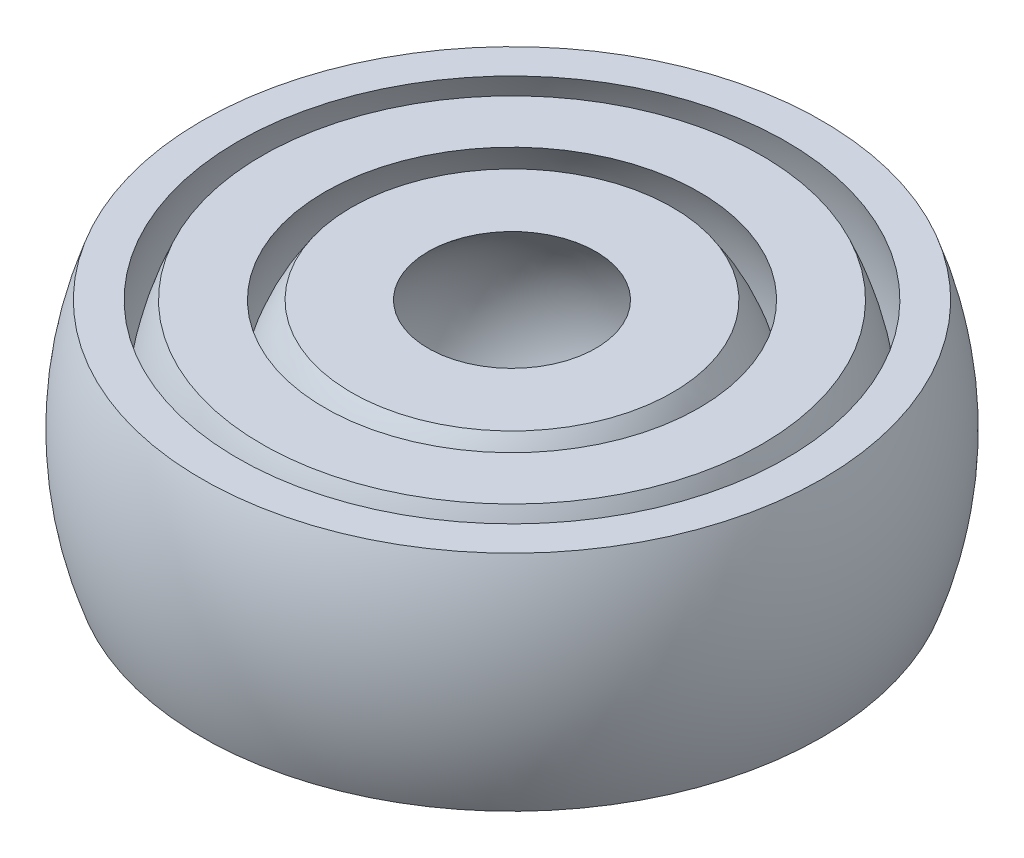
ISO-10303-21;
HEADER;
FILE_DESCRIPTION(('STEP AP214'),'2;1');
FILE_NAME('part.step','',(''),(''),'','','');
FILE_SCHEMA(('AUTOMOTIVE_DESIGN { 1 0 10303 214 1 1 1 1 }'));
ENDSEC;
DATA;
#1=APPLICATION_CONTEXT('core data for automotive mechanical design processes');
#2=APPLICATION_PROTOCOL_DEFINITION('international standard','automotive_design',2000,#1);
#3=PRODUCT_CONTEXT('',#1,'mechanical');
#4=PRODUCT('Part','Part','',(#3));
#5=PRODUCT_RELATED_PRODUCT_CATEGORY('part','',(#4));
#6=PRODUCT_DEFINITION_FORMATION('','',#4);
#7=PRODUCT_DEFINITION_CONTEXT('part definition',#1,'design');
#8=PRODUCT_DEFINITION('design','',#6,#7);
#9=PRODUCT_DEFINITION_SHAPE('','',#8);
#10=(LENGTH_UNIT() NAMED_UNIT(*) SI_UNIT(.MILLI.,.METRE.));
#11=(NAMED_UNIT(*) PLANE_ANGLE_UNIT() SI_UNIT($,.RADIAN.));
#12=(NAMED_UNIT(*) SI_UNIT($,.STERADIAN.) SOLID_ANGLE_UNIT());
#13=UNCERTAINTY_MEASURE_WITH_UNIT(LENGTH_MEASURE(1.E-05),#10,'distance_accuracy_value','');
#14=(GEOMETRIC_REPRESENTATION_CONTEXT(3) GLOBAL_UNCERTAINTY_ASSIGNED_CONTEXT((#13)) GLOBAL_UNIT_ASSIGNED_CONTEXT((#10,
#11,#12)) REPRESENTATION_CONTEXT('',''));
#15=CARTESIAN_POINT('',(0.,0.,0.));
#16=DIRECTION('',(0.,0.,1.));
#17=DIRECTION('',(1.,0.,0.));
#18=AXIS2_PLACEMENT_3D('',#15,#16,#17);
#19=CARTESIAN_POINT('',(0.,0.,0.));
#20=DIRECTION('',(0.,1.,0.));
#21=DIRECTION('',(-1.,0.,0.));
#22=AXIS2_PLACEMENT_3D('',#19,#20,#21);
#23=SPHERICAL_SURFACE('',#22,11.8);
#24=CARTESIAN_POINT('',(0.,-4.,0.));
#25=DIRECTION('',(0.,1.,0.));
#26=DIRECTION('',(0.,0.,1.));
#27=AXIS2_PLACEMENT_3D('',#24,#25,#26);
#28=CIRCLE('',#27,11.1013512691023);
#29=CARTESIAN_POINT('',(-11.1013512691023,-4.,0.));
#30=VERTEX_POINT('',#29);
#31=EDGE_CURVE('E11',#30,#30,#28,.T.);
#32=CARTESIAN_POINT('',(0.,4.,0.));
#33=DIRECTION('',(0.,1.,0.));
#34=DIRECTION('',(0.,0.,1.));
#35=AXIS2_PLACEMENT_3D('',#32,#33,#34);
#36=CIRCLE('',#35,11.1013512691023);
#37=CARTESIAN_POINT('',(-11.1013512691023,4.,0.));
#38=VERTEX_POINT('',#37);
#39=EDGE_CURVE('E65',#38,#38,#36,.T.);
#40=CARTESIAN_POINT('',(-11.1013512691023,-4.,0.));
#41=CARTESIAN_POINT('',(-11.1301710599634,-3.92001579919711,0.));
#42=CARTESIAN_POINT('',(-11.1581261449442,-3.8397200367347,0.));
#43=CARTESIAN_POINT('',(-11.2122944849113,-3.67854311663625,0.));
#44=CARTESIAN_POINT('',(-11.2385077398974,-3.59766195900022,0.));
#45=CARTESIAN_POINT('',(-11.2891800016407,-3.43535197669995,0.));
#46=CARTESIAN_POINT('',(-11.3136390083979,-3.35392315203572,0.));
#47=CARTESIAN_POINT('',(-11.3607913930384,-3.19055589296257,0.));
#48=CARTESIAN_POINT('',(-11.3834847709218,-3.10861745855365,0.));
#49=CARTESIAN_POINT('',(-11.4270952836097,-2.94426925571812,0.));
#50=CARTESIAN_POINT('',(-11.4480124184142,-2.86185948729149,0.));
#51=CARTESIAN_POINT('',(-11.4880606762165,-2.6966071176059,0.));
#52=CARTESIAN_POINT('',(-11.5071917992142,-2.61376451634692,0.));
#53=CARTESIAN_POINT('',(-11.5436590948669,-2.44768518298244,0.));
#54=CARTESIAN_POINT('',(-11.5609952675218,-2.36444845087693,0.));
#55=CARTESIAN_POINT('',(-11.5938645636387,-2.19761974231239,0.));
#56=CARTESIAN_POINT('',(-11.6093976871008,-2.11402776585336,0.));
#57=CARTESIAN_POINT('',(-11.638653628027,-1.9465276209361,0.));
#58=CARTESIAN_POINT('',(-11.652376445491,-1.86261945247788,0.));
#59=CARTESIAN_POINT('',(-11.6780053634325,-1.6945261236618,0.));
#60=CARTESIAN_POINT('',(-11.68991146391,-1.61034096330395,0.));
#61=CARTESIAN_POINT('',(-11.7119013855996,-1.44173298018558,0.));
#62=CARTESIAN_POINT('',(-11.7219852068116,-1.35731015742507,0.));
#63=CARTESIAN_POINT('',(-11.7403258590267,-1.18826629003104,0.));
#64=CARTESIAN_POINT('',(-11.7485826900298,-1.10364524539753,0.));
#65=CARTESIAN_POINT('',(-11.7632655044127,-0.934244467391672,0.));
#66=CARTESIAN_POINT('',(-11.7696914877925,-0.849464734019327,0.));
#67=CARTESIAN_POINT('',(-11.7807096048474,-0.679786185806069,0.));
#68=CARTESIAN_POINT('',(-11.7853017385226,-0.594887370965155,0.));
#69=CARTESIAN_POINT('',(-11.792650010822,-0.425010322717291,0.));
#70=CARTESIAN_POINT('',(-11.7954061494463,-0.340032089310341,0.));
#71=CARTESIAN_POINT('',(-11.7990811440353,-0.170035903935593,0.));
#72=CARTESIAN_POINT('',(-11.8,-0.0850179519677967,0.));
#73=CARTESIAN_POINT('',(-11.8,0.0850179519677967,0.));
#74=CARTESIAN_POINT('',(-11.7990811440353,0.170035903935593,0.));
#75=CARTESIAN_POINT('',(-11.7954061494463,0.340032089310341,0.));
#76=CARTESIAN_POINT('',(-11.792650010822,0.425010322717291,0.));
#77=CARTESIAN_POINT('',(-11.7853017385226,0.594887370965155,0.));
#78=CARTESIAN_POINT('',(-11.7807096048474,0.679786185806069,0.));
#79=CARTESIAN_POINT('',(-11.7696914877925,0.849464734019327,0.));
#80=CARTESIAN_POINT('',(-11.7632655044127,0.934244467391672,0.));
#81=CARTESIAN_POINT('',(-11.7485826900298,1.10364524539753,0.));
#82=CARTESIAN_POINT('',(-11.7403258590267,1.18826629003104,0.));
#83=CARTESIAN_POINT('',(-11.7219852068116,1.35731015742507,0.));
#84=CARTESIAN_POINT('',(-11.7119013855996,1.44173298018558,0.));
#85=CARTESIAN_POINT('',(-11.68991146391,1.61034096330395,0.));
#86=CARTESIAN_POINT('',(-11.6780053634325,1.6945261236618,0.));
#87=CARTESIAN_POINT('',(-11.652376445491,1.86261945247788,0.));
#88=CARTESIAN_POINT('',(-11.638653628027,1.9465276209361,0.));
#89=CARTESIAN_POINT('',(-11.6093976871008,2.11402776585336,0.));
#90=CARTESIAN_POINT('',(-11.5938645636387,2.19761974231239,0.));
#91=CARTESIAN_POINT('',(-11.5609952675218,2.36444845087693,0.));
#92=CARTESIAN_POINT('',(-11.5436590948669,2.44768518298244,0.));
#93=CARTESIAN_POINT('',(-11.5071917992142,2.61376451634692,0.));
#94=CARTESIAN_POINT('',(-11.4880606762165,2.6966071176059,0.));
#95=CARTESIAN_POINT('',(-11.4480124184142,2.86185948729149,0.));
#96=CARTESIAN_POINT('',(-11.4270952836097,2.94426925571811,0.));
#97=CARTESIAN_POINT('',(-11.3834847709218,3.10861745855365,0.));
#98=CARTESIAN_POINT('',(-11.3607913930384,3.19055589296257,0.));
#99=CARTESIAN_POINT('',(-11.3136390083979,3.35392315203572,0.));
#100=CARTESIAN_POINT('',(-11.2891800016407,3.43535197669995,0.));
#101=CARTESIAN_POINT('',(-11.2385077398974,3.59766195900022,0.));
#102=CARTESIAN_POINT('',(-11.2122944849113,3.67854311663625,0.));
#103=CARTESIAN_POINT('',(-11.1581261449442,3.8397200367347,0.));
#104=CARTESIAN_POINT('',(-11.1301710599634,3.92001579919711,0.));
#105=CARTESIAN_POINT('',(-11.1013512691023,4.,0.));
#106=B_SPLINE_CURVE_WITH_KNOTS('',3,(#40,#41,#42,#43,#44,#45,#46,#47,#48,#49,#50,#51,#52,#53,
#54,#55,#56,#57,#58,#59,#60,#61,#62,#63,#64,#65,#66,#67,#68,#69,#70,#71,#72,#73,#74,#75,#76,#77,
#78,#79,#80,#81,#82,#83,#84,#85,#86,#87,#88,#89,#90,#91,#92,#93,#94,#95,#96,#97,#98,#99,#100,
#101,#102,#103,#104,#105),.UNSPECIFIED.,.F.,.F.,(4,2,2,2,2,2,2,2,2,2,2,2,2,2,2,2,2,2,2,2,2,2,2,
2,2,2,2,2,2,2,2,2,4),(0.,0.255048891228276,0.510097782456552,0.765146673684828,1.0201955649131,
1.27524445614138,1.53029334736966,1.78534223859793,2.04039112982621,2.29544002105448,
2.55048891228276,2.80553780351104,3.06058669473931,3.31563558596759,3.57068447719587,
3.82573336842414,4.08078225965242,4.33583115088069,4.59088004210897,4.84592893333725,
5.10097782456552,5.3560267157938,5.61107560702207,5.86612449825035,6.12117338947863,
6.3762222807069,6.63127117193518,6.88632006316345,7.14136895439173,7.39641784562001,
7.65146673684828,7.90651562807656,8.16156451930483),.UNSPECIFIED.);
#107=EDGE_CURVE('BSEAM51',#30,#38,#106,.T.);
#108=ORIENTED_EDGE('',*,*,#31,.T.);
#109=ORIENTED_EDGE('',*,*,#39,.F.);
#110=ORIENTED_EDGE('',*,*,#107,.T.);
#111=ORIENTED_EDGE('',*,*,#107,.F.);
#112=EDGE_LOOP('',(#108,#110,#109,#111));
#113=FACE_BOUND('',#112,.T.);
#114=ADVANCED_FACE('F51',(#113),#23,.T.);
#115=CARTESIAN_POINT('',(-9.81631295344642,-3.99999999999999,0.));
#116=DIRECTION('',(0.,-1.,0.));
#117=DIRECTION('',(0.,0.,-1.));
#118=AXIS2_PLACEMENT_3D('',#115,#116,#117);
#119=PLANE('',#118);
#120=CARTESIAN_POINT('',(0.,-3.99999999999999,0.));
#121=DIRECTION('',(0.,1.,0.));
#122=DIRECTION('',(0.,0.,1.));
#123=AXIS2_PLACEMENT_3D('',#120,#121,#122);
#124=CIRCLE('',#123,9.81631295344643);
#125=CARTESIAN_POINT('',(-9.81631295344643,-3.99999999999999,0.));
#126=VERTEX_POINT('',#125);
#127=EDGE_CURVE('E57',#126,#126,#124,.T.);
#128=ORIENTED_EDGE('',*,*,#127,.T.);
#129=EDGE_LOOP('',(#128));
#130=FACE_BOUND('',#129,.T.);
#131=ORIENTED_EDGE('',*,*,#31,.F.);
#132=EDGE_LOOP('',(#131));
#133=FACE_BOUND('',#132,.T.);
#134=ADVANCED_FACE('F75',(#130,#133),#119,.T.);
#135=CARTESIAN_POINT('',(0.,0.,0.));
#136=DIRECTION('',(0.,1.,0.));
#137=DIRECTION('',(-1.,0.,0.));
#138=AXIS2_PLACEMENT_3D('',#135,#136,#137);
#139=SPHERICAL_SURFACE('',#138,10.6);
#140=CARTESIAN_POINT('',(0.,4.,0.));
#141=DIRECTION('',(0.,1.,0.));
#142=DIRECTION('',(0.,0.,1.));
#143=AXIS2_PLACEMENT_3D('',#140,#141,#142);
#144=CIRCLE('',#143,9.81631295344642);
#145=CARTESIAN_POINT('',(-9.81631295344642,4.,0.));
#146=VERTEX_POINT('',#145);
#147=EDGE_CURVE('E61',#146,#146,#144,.T.);
#148=CARTESIAN_POINT('',(-9.81631295344642,4.,0.));
#149=CARTESIAN_POINT('',(-9.84855834279525,3.92086786663995,0.));
#150=CARTESIAN_POINT('',(-9.87984647175097,3.84134567387143,0.));
#151=CARTESIAN_POINT('',(-9.94049080166358,3.68156801485941,0.));
#152=CARTESIAN_POINT('',(-9.96984700262048,3.60131254861591,0.));
#153=CARTESIAN_POINT('',(-10.0266100693229,3.44011518799585,0.));
#154=CARTESIAN_POINT('',(-10.0540169350684,3.3591732936193,0.));
#155=CARTESIAN_POINT('',(-10.1068653669124,3.19665043842806,0.));
#156=CARTESIAN_POINT('',(-10.1323069330109,3.11506947761337,0.));
#157=CARTESIAN_POINT('',(-10.1812098693757,2.95131619419783,0.));
#158=CARTESIAN_POINT('',(-10.2046712396419,2.86914387159698,0.));
#159=CARTESIAN_POINT('',(-10.2496000679748,2.70425592335841,0.));
#160=CARTESIAN_POINT('',(-10.2710675260414,2.62154029772069,0.));
#161=CARTESIAN_POINT('',(-10.3119959738873,2.45561411768811,0.));
#162=CARTESIAN_POINT('',(-10.3314569636665,2.37240356329325,0.));
#163=CARTESIAN_POINT('',(-10.3683610938573,2.20553619006864,0.));
#164=CARTESIAN_POINT('',(-10.3858042342689,2.12187937123888,0.));
#165=CARTESIAN_POINT('',(-10.4186624643289,1.95416839429772,0.));
#166=CARTESIAN_POINT('',(-10.4340775539773,1.87011423618632,0.));
#167=CARTESIAN_POINT('',(-10.4628706672965,1.7016577382544,0.));
#168=CARTESIAN_POINT('',(-10.4762486909674,1.61725539843388,0.));
#169=CARTESIAN_POINT('',(-10.5009598484284,1.44815189827267,0.));
#170=CARTESIAN_POINT('',(-10.5122929822186,1.36345073793198,0.));
#171=CARTESIAN_POINT('',(-10.5329077319405,1.19379913268222,0.));
#172=CARTESIAN_POINT('',(-10.5421893478722,1.10884868777316,0.));
#173=CARTESIAN_POINT('',(-10.5586956336904,0.938748195127257,0.));
#174=CARTESIAN_POINT('',(-10.5659203035769,0.853598147390413,0.));
#175=CARTESIAN_POINT('',(-10.5783084720865,0.683148247563874,0.));
#176=CARTESIAN_POINT('',(-10.5834719707096,0.59784839547418,0.));
#177=CARTESIAN_POINT('',(-10.591734776913,0.427148773027199,0.));
#178=CARTESIAN_POINT('',(-10.5948340844933,0.341749002669911,0.));
#179=CARTESIAN_POINT('',(-10.5989666960368,0.170899488208416,0.));
#180=CARTESIAN_POINT('',(-10.6,0.0854497441042095,0.));
#181=CARTESIAN_POINT('',(-10.6,-0.0854497441042037,0.));
#182=CARTESIAN_POINT('',(-10.5989666960368,-0.17089948820841,0.));
#183=CARTESIAN_POINT('',(-10.5948340844933,-0.341749002669905,0.));
#184=CARTESIAN_POINT('',(-10.591734776913,-0.427148773027193,0.));
#185=CARTESIAN_POINT('',(-10.5834719707096,-0.597848395474175,0.));
#186=CARTESIAN_POINT('',(-10.5783084720865,-0.683148247563869,0.));
#187=CARTESIAN_POINT('',(-10.5659203035769,-0.853598147390407,0.));
#188=CARTESIAN_POINT('',(-10.5586956336904,-0.938748195127251,0.));
#189=CARTESIAN_POINT('',(-10.5421893478722,-1.10884868777316,0.));
#190=CARTESIAN_POINT('',(-10.5329077319405,-1.19379913268222,0.));
#191=CARTESIAN_POINT('',(-10.5122929822186,-1.36345073793197,0.));
#192=CARTESIAN_POINT('',(-10.5009598484284,-1.44815189827267,0.));
#193=CARTESIAN_POINT('',(-10.4762486909674,-1.61725539843388,0.));
#194=CARTESIAN_POINT('',(-10.4628706672965,-1.70165773825439,0.));
#195=CARTESIAN_POINT('',(-10.4340775539773,-1.87011423618631,0.));
#196=CARTESIAN_POINT('',(-10.4186624643289,-1.95416839429771,0.));
#197=CARTESIAN_POINT('',(-10.3858042342689,-2.12187937123887,0.));
#198=CARTESIAN_POINT('',(-10.3683610938573,-2.20553619006863,0.));
#199=CARTESIAN_POINT('',(-10.3314569636665,-2.37240356329325,0.));
#200=CARTESIAN_POINT('',(-10.3119959738873,-2.45561411768811,0.));
#201=CARTESIAN_POINT('',(-10.2710675260414,-2.62154029772068,0.));
#202=CARTESIAN_POINT('',(-10.2496000679748,-2.7042559233584,0.));
#203=CARTESIAN_POINT('',(-10.2046712396419,-2.86914387159697,0.));
#204=CARTESIAN_POINT('',(-10.1812098693757,-2.95131619419782,0.));
#205=CARTESIAN_POINT('',(-10.1323069330109,-3.11506947761337,0.));
#206=CARTESIAN_POINT('',(-10.1068653669124,-3.19665043842805,0.));
#207=CARTESIAN_POINT('',(-10.0540169350684,-3.35917329361929,0.));
#208=CARTESIAN_POINT('',(-10.0266100693229,-3.44011518799585,0.));
#209=CARTESIAN_POINT('',(-9.96984700262049,-3.6013125486159,0.));
#210=CARTESIAN_POINT('',(-9.94049080166358,-3.68156801485941,0.));
#211=CARTESIAN_POINT('',(-9.87984647175097,-3.84134567387142,0.));
#212=CARTESIAN_POINT('',(-9.84855834279526,-3.92086786663994,0.));
#213=CARTESIAN_POINT('',(-9.81631295344643,-3.99999999999999,0.));
#214=B_SPLINE_CURVE_WITH_KNOTS('',3,(#148,#149,#150,#151,#152,#153,#154,#155,#156,#157,#158,
#159,#160,#161,#162,#163,#164,#165,#166,#167,#168,#169,#170,#171,#172,#173,#174,#175,#176,#177,
#178,#179,#180,#181,#182,#183,#184,#185,#186,#187,#188,#189,#190,#191,#192,#193,#194,#195,#196,
#197,#198,#199,#200,#201,#202,#203,#204,#205,#206,#207,#208,#209,#210,#211,#212,#213),
.UNSPECIFIED.,.F.,.F.,(4,2,2,2,2,2,2,2,2,2,2,2,2,2,2,2,2,2,2,2,2,2,2,2,2,2,2,2,2,2,2,2,4),(0.,
0.256342985822636,0.512685971645271,0.769028957467907,1.02537194329054,1.28171492911318,
1.53805791493581,1.79440090075845,2.05074388658108,2.30708687240372,2.56342985822635,
2.81977284404899,3.07611582987162,3.33245881569426,3.58880180151689,3.84514478733953,
4.10148777316216,4.3578307589848,4.61417374480743,4.87051673063007,5.1268597164527,
5.38320270227534,5.63954568809797,5.89588867392061,6.15223165974324,6.40857464556588,
6.66491763138851,6.92126061721115,7.17760360303378,7.43394658885642,7.69028957467905,
7.94663256050169,8.20297554632432),.UNSPECIFIED.);
#215=EDGE_CURVE('BSEAM79',#146,#126,#214,.T.);
#216=ORIENTED_EDGE('',*,*,#147,.T.);
#217=ORIENTED_EDGE('',*,*,#127,.F.);
#218=ORIENTED_EDGE('',*,*,#215,.T.);
#219=ORIENTED_EDGE('',*,*,#215,.F.);
#220=EDGE_LOOP('',(#216,#218,#217,#219));
#221=FACE_BOUND('',#220,.T.);
#222=ADVANCED_FACE('F79',(#221),#139,.F.);
#223=CARTESIAN_POINT('',(-9.81631295344642,4.,0.));
#224=DIRECTION('',(0.,1.,0.));
#225=DIRECTION('',(0.,0.,1.));
#226=AXIS2_PLACEMENT_3D('',#223,#224,#225);
#227=PLANE('',#226);
#228=ORIENTED_EDGE('',*,*,#39,.T.);
#229=EDGE_LOOP('',(#228));
#230=FACE_BOUND('',#229,.T.);
#231=ORIENTED_EDGE('',*,*,#147,.F.);
#232=EDGE_LOOP('',(#231));
#233=FACE_BOUND('',#232,.T.);
#234=ADVANCED_FACE('F71',(#230,#233),#227,.T.);
#235=CLOSED_SHELL('',(#114,#134,#222,#234));
#236=MANIFOLD_SOLID_BREP('B2',#235);
#237=CARTESIAN_POINT('',(0.,0.,0.));
#238=DIRECTION('',(0.,1.,0.));
#239=DIRECTION('',(1.,0.,0.));
#240=AXIS2_PLACEMENT_3D('',#237,#238,#239);
#241=SPHERICAL_SURFACE('',#240,7.8);
#242=CARTESIAN_POINT('',(0.,4.,0.));
#243=DIRECTION('',(0.,1.,0.));
#244=DIRECTION('',(0.,0.,1.));
#245=AXIS2_PLACEMENT_3D('',#242,#243,#244);
#246=CIRCLE('',#245,6.69626761711328);
#247=CARTESIAN_POINT('',(6.69626761711328,4.,0.));
#248=VERTEX_POINT('',#247);
#249=EDGE_CURVE('E144',#248,#248,#246,.T.);
#250=CARTESIAN_POINT('',(0.,-4.,0.));
#251=DIRECTION('',(0.,1.,0.));
#252=DIRECTION('',(0.,0.,1.));
#253=AXIS2_PLACEMENT_3D('',#250,#251,#252);
#254=CIRCLE('',#253,6.69626761711328);
#255=CARTESIAN_POINT('',(6.69626761711328,-4.,0.));
#256=VERTEX_POINT('',#255);
#257=EDGE_CURVE('E50',#256,#256,#254,.T.);
#258=CARTESIAN_POINT('',(6.69626761711328,4.,0.));
#259=CARTESIAN_POINT('',(6.74114039020911,3.92488114280004,0.));
#260=CARTESIAN_POINT('',(6.78474809918697,3.84900664312521,0.));
#261=CARTESIAN_POINT('',(6.86938630518451,3.69583355845356,0.));
#262=CARTESIAN_POINT('',(6.9104168022042,3.61853497345673,0.));
#263=CARTESIAN_POINT('',(6.98985350056321,3.46260091776879,0.));
#264=CARTESIAN_POINT('',(7.02825970190254,3.38396544707768,0.));
#265=CARTESIAN_POINT('',(7.10240447924619,3.22544676578967,0.));
#266=CARTESIAN_POINT('',(7.13814305525052,3.14556355519277,0.));
#267=CARTESIAN_POINT('',(7.20691206379606,2.98463983715201,0.));
#268=CARTESIAN_POINT('',(7.23994249633729,2.90359932970814,0.));
#269=CARTESIAN_POINT('',(7.30325782294333,2.74045280269426,0.));
#270=CARTESIAN_POINT('',(7.33354271700815,2.65834678312425,0.));
#271=CARTESIAN_POINT('',(7.39133266591808,2.49316221495515,0.));
#272=CARTESIAN_POINT('',(7.4188377207632,2.41008366635607,0.));
#273=CARTESIAN_POINT('',(7.4710368426825,2.24304812684007,0.));
#274=CARTESIAN_POINT('',(7.49573090975667,2.15909113592316,0.));
#275=CARTESIAN_POINT('',(7.54228008993898,1.99039379271953,0.));
#276=CARTESIAN_POINT('',(7.56413520304711,1.90565344043281,0.));
#277=CARTESIAN_POINT('',(7.60498172449966,1.73548534275223,0.));
#278=CARTESIAN_POINT('',(7.62397313284408,1.65005759735836,0.));
#279=CARTESIAN_POINT('',(7.65907073703221,1.47861146015422,0.));
#280=CARTESIAN_POINT('',(7.67517693287591,1.39259306834393,0.));
#281=CARTESIAN_POINT('',(7.70448587184203,1.22006305391468,0.));
#282=CARTESIAN_POINT('',(7.71768861496444,1.1335514312957,0.));
#283=CARTESIAN_POINT('',(7.74117569641451,0.960132929436343,0.));
#284=CARTESIAN_POINT('',(7.75146003474217,0.873226050195953,0.));
#285=CARTESIAN_POINT('',(7.76909865961659,0.699115456908946,0.));
#286=CARTESIAN_POINT('',(7.77645294616335,0.611911742862328,0.));
#287=CARTESIAN_POINT('',(7.78822313876549,0.437306237942481,0.));
#288=CARTESIAN_POINT('',(7.79263904482087,0.349904447069251,0.));
#289=CARTESIAN_POINT('',(7.79852747543812,0.175001770797347,0.));
#290=CARTESIAN_POINT('',(7.8,0.0875008853986726,0.));
#291=CARTESIAN_POINT('',(7.8,-0.0875008853986761,0.));
#292=CARTESIAN_POINT('',(7.79852747543812,-0.17500177079735,0.));
#293=CARTESIAN_POINT('',(7.79263904482087,-0.349904447069254,0.));
#294=CARTESIAN_POINT('',(7.78822313876549,-0.437306237942484,0.));
#295=CARTESIAN_POINT('',(7.77645294616335,-0.611911742862331,0.));
#296=CARTESIAN_POINT('',(7.76909865961658,-0.699115456908949,0.));
#297=CARTESIAN_POINT('',(7.75146003474217,-0.873226050195957,0.));
#298=CARTESIAN_POINT('',(7.74117569641451,-0.960132929436346,0.));
#299=CARTESIAN_POINT('',(7.71768861496444,-1.13355143129571,0.));
#300=CARTESIAN_POINT('',(7.70448587184203,-1.22006305391468,0.));
#301=CARTESIAN_POINT('',(7.67517693287591,-1.39259306834393,0.));
#302=CARTESIAN_POINT('',(7.65907073703221,-1.47861146015422,0.));
#303=CARTESIAN_POINT('',(7.62397313284408,-1.65005759735837,0.));
#304=CARTESIAN_POINT('',(7.60498172449966,-1.73548534275223,0.));
#305=CARTESIAN_POINT('',(7.5641352030471,-1.90565344043281,0.));
#306=CARTESIAN_POINT('',(7.54228008993897,-1.99039379271953,0.));
#307=CARTESIAN_POINT('',(7.49573090975667,-2.15909113592316,0.));
#308=CARTESIAN_POINT('',(7.4710368426825,-2.24304812684007,0.));
#309=CARTESIAN_POINT('',(7.4188377207632,-2.41008366635607,0.));
#310=CARTESIAN_POINT('',(7.39133266591808,-2.49316221495516,0.));
#311=CARTESIAN_POINT('',(7.33354271700815,-2.65834678312425,0.));
#312=CARTESIAN_POINT('',(7.30325782294333,-2.74045280269426,0.));
#313=CARTESIAN_POINT('',(7.23994249633729,-2.90359932970814,0.));
#314=CARTESIAN_POINT('',(7.20691206379606,-2.98463983715201,0.));
#315=CARTESIAN_POINT('',(7.13814305525052,-3.14556355519278,0.));
#316=CARTESIAN_POINT('',(7.10240447924619,-3.22544676578967,0.));
#317=CARTESIAN_POINT('',(7.02825970190254,-3.38396544707769,0.));
#318=CARTESIAN_POINT('',(6.98985350056321,-3.4626009177688,0.));
#319=CARTESIAN_POINT('',(6.9104168022042,-3.61853497345674,0.));
#320=CARTESIAN_POINT('',(6.86938630518451,-3.69583355845357,0.));
#321=CARTESIAN_POINT('',(6.78474809918696,-3.84900664312522,0.));
#322=CARTESIAN_POINT('',(6.74114039020911,-3.92488114280004,0.));
#323=CARTESIAN_POINT('',(6.69626761711328,-4.,0.));
#324=B_SPLINE_CURVE_WITH_KNOTS('',3,(#258,#259,#260,#261,#262,#263,#264,#265,#266,#267,#268,
#269,#270,#271,#272,#273,#274,#275,#276,#277,#278,#279,#280,#281,#282,#283,#284,#285,#286,#287,
#288,#289,#290,#291,#292,#293,#294,#295,#296,#297,#298,#299,#300,#301,#302,#303,#304,#305,#306,
#307,#308,#309,#310,#311,#312,#313,#314,#315,#316,#317,#318,#319,#320,#321,#322,#323),
.UNSPECIFIED.,.F.,.F.,(4,2,2,2,2,2,2,2,2,2,2,2,2,2,2,2,2,2,2,2,2,2,2,2,2,2,2,2,2,2,2,2,4),(0.,
0.262490270257468,0.524980540514937,0.787470810772405,1.04996108102987,1.31245135128734,
1.57494162154481,1.83743189180228,2.09992216205975,2.36241243231721,2.62490270257468,
2.88739297283215,3.14988324308962,3.41237351334709,3.67486378360456,3.93735405386203,
4.19984432411949,4.46233459437696,4.72482486463443,4.9873151348919,5.24980540514937,
5.51229567540684,5.7747859456643,6.03727621592177,6.29976648617924,6.56225675643671,
6.82474702669418,7.08723729695165,7.34972756720911,7.61221783746658,7.87470810772405,
8.13719837798152,8.39968864823899),.UNSPECIFIED.);
#325=EDGE_CURVE('BSEAM127',#248,#256,#324,.T.);
#326=ORIENTED_EDGE('',*,*,#249,.T.);
#327=ORIENTED_EDGE('',*,*,#257,.F.);
#328=ORIENTED_EDGE('',*,*,#325,.T.);
#329=ORIENTED_EDGE('',*,*,#325,.F.);
#330=EDGE_LOOP('',(#326,#328,#327,#329));
#331=FACE_BOUND('',#330,.T.);
#332=ADVANCED_FACE('F127',(#331),#241,.F.);
#333=CARTESIAN_POINT('',(0.,-4.,0.));
#334=DIRECTION('',(0.,1.,0.));
#335=DIRECTION('',(0.,0.,1.));
#336=AXIS2_PLACEMENT_3D('',#333,#334,#335);
#337=PLANE('',#336);
#338=CARTESIAN_POINT('',(0.,-4.,0.));
#339=DIRECTION('',(0.,1.,0.));
#340=DIRECTION('',(0.,0.,1.));
#341=AXIS2_PLACEMENT_3D('',#338,#339,#340);
#342=CIRCLE('',#341,8.94650769853802);
#343=CARTESIAN_POINT('',(8.94650769853802,-4.,0.));
#344=VERTEX_POINT('',#343);
#345=EDGE_CURVE('E134',#344,#344,#342,.T.);
#346=ORIENTED_EDGE('',*,*,#345,.F.);
#347=EDGE_LOOP('',(#346));
#348=FACE_BOUND('',#347,.T.);
#349=ORIENTED_EDGE('',*,*,#257,.T.);
#350=EDGE_LOOP('',(#349));
#351=FACE_BOUND('',#350,.T.);
#352=ADVANCED_FACE('F161',(#348,#351),#337,.F.);
#353=CARTESIAN_POINT('',(0.,0.,0.));
#354=DIRECTION('',(0.,1.,0.));
#355=DIRECTION('',(1.,0.,0.));
#356=AXIS2_PLACEMENT_3D('',#353,#354,#355);
#357=SPHERICAL_SURFACE('',#356,9.8);
#358=CARTESIAN_POINT('',(0.,4.,0.));
#359=DIRECTION('',(0.,1.,0.));
#360=DIRECTION('',(0.,0.,1.));
#361=AXIS2_PLACEMENT_3D('',#358,#359,#360);
#362=CIRCLE('',#361,8.94650769853802);
#363=CARTESIAN_POINT('',(8.94650769853802,4.,0.));
#364=VERTEX_POINT('',#363);
#365=EDGE_CURVE('E139',#364,#364,#362,.T.);
#366=CARTESIAN_POINT('',(8.94650769853802,4.,0.));
#367=CARTESIAN_POINT('',(8.98154472307547,3.92163593252445,0.));
#368=CARTESIAN_POINT('',(9.01555163086516,3.84281131190357,0.));
#369=CARTESIAN_POINT('',(9.08148286624306,3.68429586220221,0.));
#370=CARTESIAN_POINT('',(9.11340719383127,3.60460503312172,0.));
#371=CARTESIAN_POINT('',(9.1751509221002,3.44441206433217,0.));
#372=CARTESIAN_POINT('',(9.20497032278093,3.3639099246231,0.));
#373=CARTESIAN_POINT('',(9.26248368922102,3.20214995285234,0.));
#374=CARTESIAN_POINT('',(9.29017765498038,3.12089212079064,0.));
#375=CARTESIAN_POINT('',(9.34342100787445,2.95767686143327,0.));
#376=CARTESIAN_POINT('',(9.36897039500915,2.8757194341376,0.));
#377=CARTESIAN_POINT('',(9.41790695538373,2.71116157598736,0.));
#378=CARTESIAN_POINT('',(9.44129412862362,2.62856114513278,0.));
#379=CARTESIAN_POINT('',(9.48589011147247,2.46277431243219,0.));
#380=CARTESIAN_POINT('',(9.50709892108144,2.37958791058618,0.));
#381=CARTESIAN_POINT('',(9.54732353301586,2.21268657389239,0.));
#382=CARTESIAN_POINT('',(9.56633933534131,2.1289716390446,0.));
#383=CARTESIAN_POINT('',(9.6021648027323,1.96107103905239,0.));
#384=CARTESIAN_POINT('',(9.61897446779784,1.87688537390797,0.));
#385=CARTESIAN_POINT('',(9.65037605410944,1.70810144111264,0.));
#386=CARTESIAN_POINT('',(9.66496797535551,1.62350317346173,0.));
#387=CARTESIAN_POINT('',(9.69192399871867,1.45395244831784,0.));
#388=CARTESIAN_POINT('',(9.70428810083575,1.36899999082486,0.));
#389=CARTESIAN_POINT('',(9.72677994888662,1.19879954322338,0.));
#390=CARTESIAN_POINT('',(9.7369076948204,1.11355155311489,0.));
#391=CARTESIAN_POINT('',(9.75491983758715,0.942818901564571,0.));
#392=CARTESIAN_POINT('',(9.76280423442012,0.857334240122745,0.));
#393=CARTESIAN_POINT('',(9.77632423503642,0.686187270602985,0.));
#394=CARTESIAN_POINT('',(9.78195983881974,0.600524962525052,0.));
#395=CARTESIAN_POINT('',(9.79097836211458,0.429081847090108,0.));
#396=CARTESIAN_POINT('',(9.79436128162609,0.343301039733097,0.));
#397=CARTESIAN_POINT('',(9.7988721005688,0.17168015491739,0.));
#398=CARTESIAN_POINT('',(9.8,0.0858400774586942,0.));
#399=CARTESIAN_POINT('',(9.8,-0.0858400774586975,0.));
#400=CARTESIAN_POINT('',(9.7988721005688,-0.171680154917393,0.));
#401=CARTESIAN_POINT('',(9.79436128162609,-0.3433010397331,0.));
#402=CARTESIAN_POINT('',(9.79097836211458,-0.429081847090111,0.));
#403=CARTESIAN_POINT('',(9.78195983881974,-0.600524962525055,0.));
#404=CARTESIAN_POINT('',(9.77632423503642,-0.686187270602989,0.));
#405=CARTESIAN_POINT('',(9.76280423442012,-0.857334240122748,0.));
#406=CARTESIAN_POINT('',(9.75491983758715,-0.942818901564573,0.));
#407=CARTESIAN_POINT('',(9.7369076948204,-1.11355155311489,0.));
#408=CARTESIAN_POINT('',(9.72677994888662,-1.19879954322339,0.));
#409=CARTESIAN_POINT('',(9.70428810083575,-1.36899999082486,0.));
#410=CARTESIAN_POINT('',(9.69192399871867,-1.45395244831784,0.));
#411=CARTESIAN_POINT('',(9.66496797535551,-1.62350317346173,0.));
#412=CARTESIAN_POINT('',(9.65037605410944,-1.70810144111264,0.));
#413=CARTESIAN_POINT('',(9.61897446779784,-1.87688537390797,0.));
#414=CARTESIAN_POINT('',(9.6021648027323,-1.9610710390524,0.));
#415=CARTESIAN_POINT('',(9.56633933534131,-2.12897163904461,0.));
#416=CARTESIAN_POINT('',(9.54732353301586,-2.21268657389239,0.));
#417=CARTESIAN_POINT('',(9.50709892108143,-2.37958791058618,0.));
#418=CARTESIAN_POINT('',(9.48589011147247,-2.4627743124322,0.));
#419=CARTESIAN_POINT('',(9.44129412862362,-2.62856114513278,0.));
#420=CARTESIAN_POINT('',(9.41790695538373,-2.71116157598736,0.));
#421=CARTESIAN_POINT('',(9.36897039500915,-2.8757194341376,0.));
#422=CARTESIAN_POINT('',(9.34342100787445,-2.95767686143327,0.));
#423=CARTESIAN_POINT('',(9.29017765498038,-3.12089212079064,0.));
#424=CARTESIAN_POINT('',(9.26248368922102,-3.20214995285234,0.));
#425=CARTESIAN_POINT('',(9.20497032278093,-3.36390992462311,0.));
#426=CARTESIAN_POINT('',(9.1751509221002,-3.44441206433217,0.));
#427=CARTESIAN_POINT('',(9.11340719383127,-3.60460503312172,0.));
#428=CARTESIAN_POINT('',(9.08148286624306,-3.68429586220221,0.));
#429=CARTESIAN_POINT('',(9.01555163086516,-3.84281131190358,0.));
#430=CARTESIAN_POINT('',(8.98154472307547,-3.92163593252445,0.));
#431=CARTESIAN_POINT('',(8.94650769853802,-4.,0.));
#432=B_SPLINE_CURVE_WITH_KNOTS('',3,(#366,#367,#368,#369,#370,#371,#372,#373,#374,#375,#376,
#377,#378,#379,#380,#381,#382,#383,#384,#385,#386,#387,#388,#389,#390,#391,#392,#393,#394,#395,
#396,#397,#398,#399,#400,#401,#402,#403,#404,#405,#406,#407,#408,#409,#410,#411,#412,#413,#414,
#415,#416,#417,#418,#419,#420,#421,#422,#423,#424,#425,#426,#427,#428,#429,#430,#431),
.UNSPECIFIED.,.F.,.F.,(4,2,2,2,2,2,2,2,2,2,2,2,2,2,2,2,2,2,2,2,2,2,2,2,2,2,2,2,2,2,2,2,4),(0.,
0.257512823933181,0.515025647866363,0.772538471799544,1.03005129573273,1.28756411966591,
1.54507694359909,1.80258976753227,2.06010259146545,2.31761541539863,2.57512823933182,
2.832641063265,3.09015388719818,3.34766671113136,3.60517953506454,3.86269235899772,
4.1202051829309,4.37771800686409,4.63523083079727,4.89274365473045,5.15025647866363,
5.40776930259681,5.66528212652999,5.92279495046317,6.18030777439636,6.43782059832954,
6.69533342226272,6.9528462461959,7.21035907012908,7.46787189406226,7.72538471799544,
7.98289754192862,8.24041036586181),.UNSPECIFIED.);
#433=EDGE_CURVE('BSEAM155',#364,#344,#432,.T.);
#434=ORIENTED_EDGE('',*,*,#365,.F.);
#435=ORIENTED_EDGE('',*,*,#345,.T.);
#436=ORIENTED_EDGE('',*,*,#433,.T.);
#437=ORIENTED_EDGE('',*,*,#433,.F.);
#438=EDGE_LOOP('',(#434,#436,#435,#437));
#439=FACE_BOUND('',#438,.T.);
#440=ADVANCED_FACE('F155',(#439),#357,.T.);
#441=CARTESIAN_POINT('',(0.,4.,0.));
#442=DIRECTION('',(0.,1.,0.));
#443=DIRECTION('',(0.,0.,1.));
#444=AXIS2_PLACEMENT_3D('',#441,#442,#443);
#445=PLANE('',#444);
#446=ORIENTED_EDGE('',*,*,#365,.T.);
#447=EDGE_LOOP('',(#446));
#448=FACE_BOUND('',#447,.T.);
#449=ORIENTED_EDGE('',*,*,#249,.F.);
#450=EDGE_LOOP('',(#449));
#451=FACE_BOUND('',#450,.T.);
#452=ADVANCED_FACE('F153',(#448,#451),#445,.T.);
#453=CLOSED_SHELL('',(#332,#352,#440,#452));
#454=MANIFOLD_SOLID_BREP('B6',#453);
#455=CARTESIAN_POINT('',(0.,4.,0.));
#456=DIRECTION('',(0.,1.,0.));
#457=DIRECTION('',(0.,0.,1.));
#458=AXIS2_PLACEMENT_3D('',#455,#456,#457);
#459=PLANE('',#458);
#460=CARTESIAN_POINT('',(0.,4.,0.));
#461=DIRECTION('',(0.,1.,0.));
#462=DIRECTION('',(0.,0.,1.));
#463=AXIS2_PLACEMENT_3D('',#460,#461,#462);
#464=CIRCLE('',#463,5.74456264653803);
#465=CARTESIAN_POINT('',(-5.74456264653803,4.,0.));
#466=VERTEX_POINT('',#465);
#467=EDGE_CURVE('E126',#466,#466,#464,.T.);
#468=ORIENTED_EDGE('',*,*,#467,.T.);
#469=EDGE_LOOP('',(#468));
#470=FACE_BOUND('',#469,.T.);
#471=CARTESIAN_POINT('',(0.,4.,0.));
#472=DIRECTION('',(0.,1.,0.));
#473=DIRECTION('',(0.,0.,1.));
#474=AXIS2_PLACEMENT_3D('',#471,#472,#473);
#475=CIRCLE('',#474,3.);
#476=CARTESIAN_POINT('',(-3.,4.,0.));
#477=VERTEX_POINT('',#476);
#478=EDGE_CURVE('E214',#477,#477,#475,.T.);
#479=ORIENTED_EDGE('',*,*,#478,.F.);
#480=EDGE_LOOP('',(#479));
#481=FACE_BOUND('',#480,.T.);
#482=ADVANCED_FACE('F200',(#470,#481),#459,.T.);
#483=CARTESIAN_POINT('',(0.,0.,0.));
#484=DIRECTION('',(0.,1.,0.));
#485=DIRECTION('',(-1.,0.,0.));
#486=AXIS2_PLACEMENT_3D('',#483,#484,#485);
#487=SPHERICAL_SURFACE('',#486,7.);
#488=CARTESIAN_POINT('',(0.,-4.,0.));
#489=DIRECTION('',(0.,1.,0.));
#490=DIRECTION('',(0.,0.,1.));
#491=AXIS2_PLACEMENT_3D('',#488,#489,#490);
#492=CIRCLE('',#491,5.74456264653803);
#493=CARTESIAN_POINT('',(-5.74456264653803,-4.,0.));
#494=VERTEX_POINT('',#493);
#495=EDGE_CURVE('E206',#494,#494,#492,.T.);
#496=CARTESIAN_POINT('',(-5.74456264653803,-4.,0.));
#497=CARTESIAN_POINT('',(-5.79525051409779,-3.92720662252592,0.));
#498=CARTESIAN_POINT('',(-5.84455329742872,-3.85344886637828,0.));
#499=CARTESIAN_POINT('',(-5.94032068794098,-3.70411325039962,0.));
#500=CARTESIAN_POINT('',(-5.98678529512232,-3.62853539056861,0.));
#501=CARTESIAN_POINT('',(-6.07680832564349,-3.47566822088695,0.));
#502=CARTESIAN_POINT('',(-6.12036674898332,-3.3983789110363,0.));
#503=CARTESIAN_POINT('',(-6.20451470244216,-3.24220067272806,0.));
#504=CARTESIAN_POINT('',(-6.24510423256117,-3.16331174427046,0.));
#505=CARTESIAN_POINT('',(-6.32325568577923,-3.0040482227701,0.));
#506=CARTESIAN_POINT('',(-6.36081760887827,-2.92367362972733,0.));
#507=CARTESIAN_POINT('',(-6.43285958802461,-2.76155493044923,0.));
#508=CARTESIAN_POINT('',(-6.46733964407192,-2.6798108242139,0.));
#509=CARTESIAN_POINT('',(-6.53316806121795,-2.51507121532259,0.));
#510=CARTESIAN_POINT('',(-6.56451642231667,-2.43207571266661,0.));
#511=CARTESIAN_POINT('',(-6.62403615260962,-2.26495323959727,0.));
#512=CARTESIAN_POINT('',(-6.65220752180383,-2.18082626918391,0.));
#513=CARTESIAN_POINT('',(-6.70533256054413,-2.01156242325237,0.));
#514=CARTESIAN_POINT('',(-6.73028623009021,-1.92642554773419,0.));
#515=CARTESIAN_POINT('',(-6.7769398117498,-1.75526491381187,0.));
#516=CARTESIAN_POINT('',(-6.79863972386331,-1.66924115540774,0.));
#517=CARTESIAN_POINT('',(-6.83875443442011,-1.49643105940181,0.));
#518=CARTESIAN_POINT('',(-6.8571692328634,-1.40964472180001,0.));
#519=CARTESIAN_POINT('',(-6.89068710683658,-1.23543487302713,0.));
#520=CARTESIAN_POINT('',(-6.90579018236647,-1.14801136185606,0.));
#521=CARTESIAN_POINT('',(-6.93266278667728,-0.972653492279144,0.));
#522=CARTESIAN_POINT('',(-6.9444323154582,-0.884719133873311,0.));
#523=CARTESIAN_POINT('',(-6.96462081938833,-0.708466634333287,0.));
#524=CARTESIAN_POINT('',(-6.97303979453753,-0.620148493199096,0.));
#525=CARTESIAN_POINT('',(-6.98651502584647,-0.443256047271633,0.));
#526=CARTESIAN_POINT('',(-6.9915712820062,-0.35468174247836,0.));
#527=CARTESIAN_POINT('',(-6.99831376908296,-0.177404958456725,0.));
#528=CARTESIAN_POINT('',(-7.,-0.0887024792283627,0.));
#529=CARTESIAN_POINT('',(-7.,0.0887024792283627,0.));
#530=CARTESIAN_POINT('',(-6.99831376908296,0.177404958456725,0.));
#531=CARTESIAN_POINT('',(-6.9915712820062,0.35468174247836,0.));
#532=CARTESIAN_POINT('',(-6.98651502584647,0.443256047271633,0.));
#533=CARTESIAN_POINT('',(-6.97303979453753,0.620148493199096,0.));
#534=CARTESIAN_POINT('',(-6.96462081938833,0.708466634333287,0.));
#535=CARTESIAN_POINT('',(-6.9444323154582,0.884719133873311,0.));
#536=CARTESIAN_POINT('',(-6.93266278667728,0.972653492279144,0.));
#537=CARTESIAN_POINT('',(-6.90579018236647,1.14801136185606,0.));
#538=CARTESIAN_POINT('',(-6.89068710683658,1.23543487302713,0.));
#539=CARTESIAN_POINT('',(-6.8571692328634,1.40964472180001,0.));
#540=CARTESIAN_POINT('',(-6.83875443442011,1.49643105940181,0.));
#541=CARTESIAN_POINT('',(-6.79863972386331,1.66924115540774,0.));
#542=CARTESIAN_POINT('',(-6.7769398117498,1.75526491381187,0.));
#543=CARTESIAN_POINT('',(-6.73028623009021,1.92642554773419,0.));
#544=CARTESIAN_POINT('',(-6.70533256054413,2.01156242325237,0.));
#545=CARTESIAN_POINT('',(-6.65220752180383,2.18082626918391,0.));
#546=CARTESIAN_POINT('',(-6.62403615260962,2.26495323959727,0.));
#547=CARTESIAN_POINT('',(-6.56451642231667,2.43207571266661,0.));
#548=CARTESIAN_POINT('',(-6.53316806121795,2.51507121532259,0.));
#549=CARTESIAN_POINT('',(-6.46733964407192,2.6798108242139,0.));
#550=CARTESIAN_POINT('',(-6.43285958802461,2.76155493044923,0.));
#551=CARTESIAN_POINT('',(-6.36081760887827,2.92367362972733,0.));
#552=CARTESIAN_POINT('',(-6.32325568577923,3.0040482227701,0.));
#553=CARTESIAN_POINT('',(-6.24510423256117,3.16331174427046,0.));
#554=CARTESIAN_POINT('',(-6.20451470244216,3.24220067272806,0.));
#555=CARTESIAN_POINT('',(-6.12036674898332,3.3983789110363,0.));
#556=CARTESIAN_POINT('',(-6.07680832564349,3.47566822088695,0.));
#557=CARTESIAN_POINT('',(-5.98678529512233,3.62853539056861,0.));
#558=CARTESIAN_POINT('',(-5.94032068794098,3.70411325039962,0.));
#559=CARTESIAN_POINT('',(-5.84455329742872,3.85344886637828,0.));
#560=CARTESIAN_POINT('',(-5.79525051409779,3.92720662252592,0.));
#561=CARTESIAN_POINT('',(-5.74456264653803,4.,0.));
#562=B_SPLINE_CURVE_WITH_KNOTS('',3,(#496,#497,#498,#499,#500,#501,#502,#503,#504,#505,#506,
#507,#508,#509,#510,#511,#512,#513,#514,#515,#516,#517,#518,#519,#520,#521,#522,#523,#524,#525,
#526,#527,#528,#529,#530,#531,#532,#533,#534,#535,#536,#537,#538,#539,#540,#541,#542,#543,#544,
#545,#546,#547,#548,#549,#550,#551,#552,#553,#554,#555,#556,#557,#558,#559,#560,#561),
.UNSPECIFIED.,.F.,.F.,(4,2,2,2,2,2,2,2,2,2,2,2,2,2,2,2,2,2,2,2,2,2,2,2,2,2,2,2,2,2,2,2,4),(0.,
0.26609141732845,0.532182834656898,0.798274251985348,1.0643656693138,1.33045708664225,
1.5965485039707,1.86263992129914,2.12873133862759,2.39482275595604,2.66091417328449,
2.92700559061294,3.19309700794139,3.45918842526984,3.72527984259829,3.99137125992674,
4.25746267725519,4.52355409458364,4.78964551191209,5.05573692924054,5.32182834656899,
5.58791976389744,5.85401118122588,6.12010259855433,6.38619401588278,6.65228543321123,
6.91837685053968,7.18446826786813,7.45055968519658,7.71665110252503,7.98274251985348,
8.24883393718193,8.51492535451038),.UNSPECIFIED.);
#563=EDGE_CURVE('BSEAM223',#494,#466,#562,.T.);
#564=ORIENTED_EDGE('',*,*,#495,.T.);
#565=ORIENTED_EDGE('',*,*,#467,.F.);
#566=ORIENTED_EDGE('',*,*,#563,.T.);
#567=ORIENTED_EDGE('',*,*,#563,.F.);
#568=EDGE_LOOP('',(#564,#566,#565,#567));
#569=FACE_BOUND('',#568,.T.);
#570=ADVANCED_FACE('F223',(#569),#487,.T.);
#571=CARTESIAN_POINT('',(0.,-4.,0.));
#572=DIRECTION('',(0.,1.,0.));
#573=DIRECTION('',(0.,0.,1.));
#574=AXIS2_PLACEMENT_3D('',#571,#572,#573);
#575=PLANE('',#574);
#576=ORIENTED_EDGE('',*,*,#495,.F.);
#577=EDGE_LOOP('',(#576));
#578=FACE_BOUND('',#577,.T.);
#579=CARTESIAN_POINT('',(0.,-4.,0.));
#580=DIRECTION('',(0.,1.,0.));
#581=DIRECTION('',(0.,0.,1.));
#582=AXIS2_PLACEMENT_3D('',#579,#580,#581);
#583=CIRCLE('',#582,3.);
#584=CARTESIAN_POINT('',(-3.,-4.,0.));
#585=VERTEX_POINT('',#584);
#586=EDGE_CURVE('E210',#585,#585,#583,.T.);
#587=ORIENTED_EDGE('',*,*,#586,.T.);
#588=EDGE_LOOP('',(#587));
#589=FACE_BOUND('',#588,.T.);
#590=ADVANCED_FACE('F227',(#578,#589),#575,.F.);
#591=CARTESIAN_POINT('',(0.,0.,0.));
#592=DIRECTION('',(0.,1.,0.));
#593=DIRECTION('',(-1.,0.,0.));
#594=AXIS2_PLACEMENT_3D('',#591,#592,#593);
#595=SPHERICAL_SURFACE('',#594,5.);
#596=CARTESIAN_POINT('',(-3.,-4.,0.));
#597=CARTESIAN_POINT('',(-3.077276775515,-3.94204663170657,0.));
#598=CARTESIAN_POINT('',(-3.1528698608554,-3.88184890774128,0.));
#599=CARTESIAN_POINT('',(-3.30044437808252,-3.7571782118284,0.));
#600=CARTESIAN_POINT('',(-3.37242580996924,-3.69270523988082,0.));
#601=CARTESIAN_POINT('',(-3.51253274718454,-3.55969751136479,0.));
#602=CARTESIAN_POINT('',(-3.58065825251311,-3.49116275479634,0.));
#603=CARTESIAN_POINT('',(-3.7128252611481,-3.3502624063782,0.));
#604=CARTESIAN_POINT('',(-3.77686676445451,-3.2778968145285,0.));
#605=CARTESIAN_POINT('',(-3.90065053673076,-3.12957757792917,0.));
#606=CARTESIAN_POINT('',(-3.96039280570059,-3.05362393317954,0.));
#607=CARTESIAN_POINT('',(-4.07537754692509,-2.89838369785238,0.));
#608=CARTESIAN_POINT('',(-4.13062001917976,-2.81909710727485,0.));
#609=CARTESIAN_POINT('',(-4.23641965218175,-2.6574572052343,0.));
#610=CARTESIAN_POINT('',(-4.28697681292907,-2.57510389377129,0.));
#611=CARTESIAN_POINT('',(-4.38323605792731,-2.40760709263323,0.));
#612=CARTESIAN_POINT('',(-4.42893814217822,-2.32246360295818,0.));
#613=CARTESIAN_POINT('',(-4.51533376782094,-2.1496723520414,0.));
#614=CARTESIAN_POINT('',(-4.55602730921274,-2.06202459079966,0.));
#615=CARTESIAN_POINT('',(-4.63226920242471,-1.88451911404273,0.));
#616=CARTESIAN_POINT('',(-4.66781755424486,-1.79466139852752,0.));
#617=CARTESIAN_POINT('',(-4.73364969857936,-1.6130377510562,0.));
#618=CARTESIAN_POINT('',(-4.76393349109371,-1.52127181910009,0.));
#619=CARTESIAN_POINT('',(-4.81913482530724,-1.3361398843813,0.));
#620=CARTESIAN_POINT('',(-4.84405236700642,-1.24277388161863,0.));
#621=CARTESIAN_POINT('',(-4.88843752767088,-1.05475532385498,0.));
#622=CARTESIAN_POINT('',(-4.90790514663615,-0.960102768854005,0.));
#623=CARTESIAN_POINT('',(-4.94132509050021,-0.769828945370247,0.));
#624=CARTESIAN_POINT('',(-4.95527741539901,-0.674207676887465,0.));
#625=CARTESIAN_POINT('',(-4.97761991988975,-0.482317518088197,0.));
#626=CARTESIAN_POINT('',(-4.98601009948169,-0.386048627771711,0.));
#627=CARTESIAN_POINT('',(-4.99720013953681,-0.193186491636817,0.));
#628=CARTESIAN_POINT('',(-5.,-0.0965932458184087,0.));
#629=CARTESIAN_POINT('',(-5.,0.0965932458184075,0.));
#630=CARTESIAN_POINT('',(-4.99720013953681,0.193186491636816,0.));
#631=CARTESIAN_POINT('',(-4.98601009948169,0.38604862777171,0.));
#632=CARTESIAN_POINT('',(-4.97761991988975,0.482317518088196,0.));
#633=CARTESIAN_POINT('',(-4.95527741539901,0.674207676887464,0.));
#634=CARTESIAN_POINT('',(-4.94132509050021,0.769828945370246,0.));
#635=CARTESIAN_POINT('',(-4.90790514663615,0.960102768854004,0.));
#636=CARTESIAN_POINT('',(-4.88843752767088,1.05475532385498,0.));
#637=CARTESIAN_POINT('',(-4.84405236700642,1.24277388161863,0.));
#638=CARTESIAN_POINT('',(-4.81913482530724,1.3361398843813,0.));
#639=CARTESIAN_POINT('',(-4.76393349109371,1.52127181910009,0.));
#640=CARTESIAN_POINT('',(-4.73364969857936,1.6130377510562,0.));
#641=CARTESIAN_POINT('',(-4.66781755424486,1.79466139852752,0.));
#642=CARTESIAN_POINT('',(-4.63226920242471,1.88451911404272,0.));
#643=CARTESIAN_POINT('',(-4.55602730921274,2.06202459079966,0.));
#644=CARTESIAN_POINT('',(-4.51533376782094,2.1496723520414,0.));
#645=CARTESIAN_POINT('',(-4.42893814217822,2.32246360295818,0.));
#646=CARTESIAN_POINT('',(-4.38323605792731,2.40760709263323,0.));
#647=CARTESIAN_POINT('',(-4.28697681292907,2.57510389377129,0.));
#648=CARTESIAN_POINT('',(-4.23641965218176,2.6574572052343,0.));
#649=CARTESIAN_POINT('',(-4.13062001917976,2.81909710727484,0.));
#650=CARTESIAN_POINT('',(-4.07537754692509,2.89838369785238,0.));
#651=CARTESIAN_POINT('',(-3.96039280570059,3.05362393317954,0.));
#652=CARTESIAN_POINT('',(-3.90065053673076,3.12957757792917,0.));
#653=CARTESIAN_POINT('',(-3.77686676445451,3.2778968145285,0.));
#654=CARTESIAN_POINT('',(-3.7128252611481,3.3502624063782,0.));
#655=CARTESIAN_POINT('',(-3.58065825251311,3.49116275479634,0.));
#656=CARTESIAN_POINT('',(-3.51253274718454,3.55969751136479,0.));
#657=CARTESIAN_POINT('',(-3.37242580996924,3.69270523988082,0.));
#658=CARTESIAN_POINT('',(-3.30044437808252,3.7571782118284,0.));
#659=CARTESIAN_POINT('',(-3.1528698608554,3.88184890774128,0.));
#660=CARTESIAN_POINT('',(-3.077276775515,3.94204663170657,0.));
#661=CARTESIAN_POINT('',(-3.,4.,0.));
#662=B_SPLINE_CURVE_WITH_KNOTS('',3,(#596,#597,#598,#599,#600,#601,#602,#603,#604,#605,#606,
#607,#608,#609,#610,#611,#612,#613,#614,#615,#616,#617,#618,#619,#620,#621,#622,#623,#624,#625,
#626,#627,#628,#629,#630,#631,#632,#633,#634,#635,#636,#637,#638,#639,#640,#641,#642,#643,#644,
#645,#646,#647,#648,#649,#650,#651,#652,#653,#654,#655,#656,#657,#658,#659,#660,#661),
.UNSPECIFIED.,.F.,.F.,(4,2,2,2,2,2,2,2,2,2,2,2,2,2,2,2,2,2,2,2,2,2,2,2,2,2,2,2,2,2,2,2,4),(0.,
0.289739201537359,0.579478403074718,0.869217604612078,1.15895680614944,1.4486960076868,
1.73843520922416,2.02817441076152,2.31791361229888,2.60765281383623,2.89739201537359,
3.18713121691095,3.47687041844831,3.76660961998567,4.05634882152303,4.34608802306039,
4.63582722459775,4.92556642613511,5.21530562767247,5.50504482920983,5.79478403074719,
6.08452323228455,6.37426243382191,6.66400163535927,6.95374083689662,7.24348003843398,
7.53321923997134,7.8229584415087,8.11269764304606,8.40243684458342,8.69217604612078,
8.98191524765814,9.2716544491955),.UNSPECIFIED.);
#663=EDGE_CURVE('BSEAM220',#585,#477,#662,.T.);
#664=ORIENTED_EDGE('',*,*,#586,.F.);
#665=ORIENTED_EDGE('',*,*,#478,.T.);
#666=ORIENTED_EDGE('',*,*,#663,.T.);
#667=ORIENTED_EDGE('',*,*,#663,.F.);
#668=EDGE_LOOP('',(#664,#666,#665,#667));
#669=FACE_BOUND('',#668,.T.);
#670=ADVANCED_FACE('F220',(#669),#595,.F.);
#671=CLOSED_SHELL('',(#482,#570,#590,#670));
#672=MANIFOLD_SOLID_BREP('B45',#671);
#673=ADVANCED_BREP_SHAPE_REPRESENTATION('',(#18,#236,#454,#672),#14);
#674=SHAPE_DEFINITION_REPRESENTATION(#9,#673);
ENDSEC;
END-ISO-10303-21;
